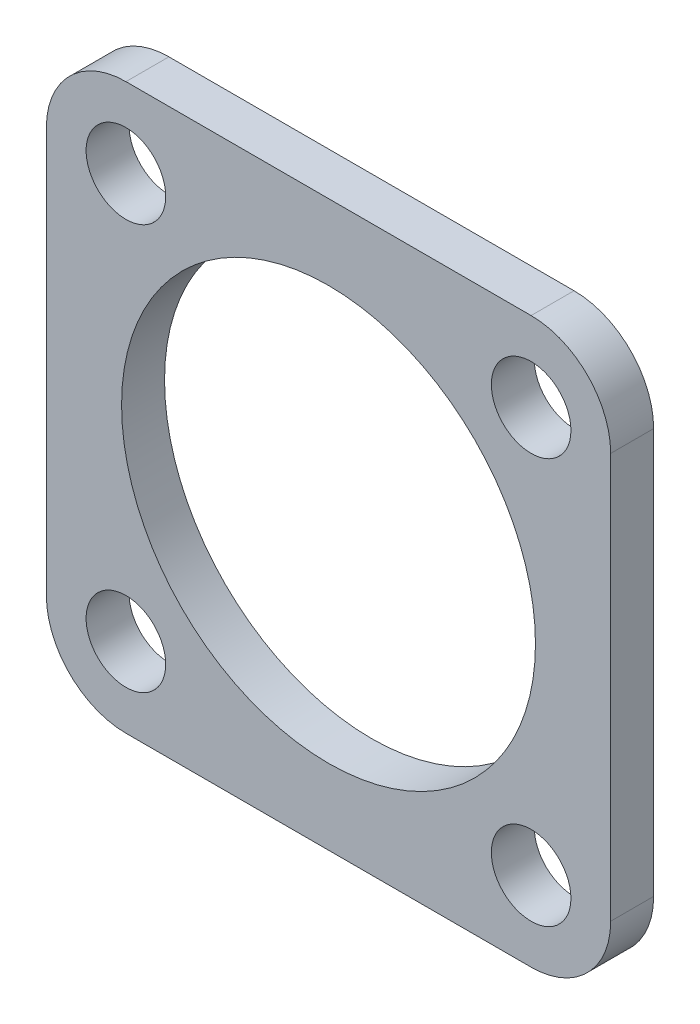
ISO-10303-21;
HEADER;
FILE_DESCRIPTION(('STEP AP214'),'2;1');
FILE_NAME('part.step','',(''),(''),'','','');
FILE_SCHEMA(('AUTOMOTIVE_DESIGN { 1 0 10303 214 1 1 1 1 }'));
ENDSEC;
DATA;
#1=APPLICATION_CONTEXT('core data for automotive mechanical design processes');
#2=APPLICATION_PROTOCOL_DEFINITION('international standard','automotive_design',2000,#1);
#3=PRODUCT_CONTEXT('',#1,'mechanical');
#4=PRODUCT('Part','Part','',(#3));
#5=PRODUCT_RELATED_PRODUCT_CATEGORY('part','',(#4));
#6=PRODUCT_DEFINITION_FORMATION('','',#4);
#7=PRODUCT_DEFINITION_CONTEXT('part definition',#1,'design');
#8=PRODUCT_DEFINITION('design','',#6,#7);
#9=PRODUCT_DEFINITION_SHAPE('','',#8);
#10=(LENGTH_UNIT() NAMED_UNIT(*) SI_UNIT(.MILLI.,.METRE.));
#11=(NAMED_UNIT(*) PLANE_ANGLE_UNIT() SI_UNIT($,.RADIAN.));
#12=(NAMED_UNIT(*) SI_UNIT($,.STERADIAN.) SOLID_ANGLE_UNIT());
#13=UNCERTAINTY_MEASURE_WITH_UNIT(LENGTH_MEASURE(1.E-05),#10,'distance_accuracy_value','');
#14=(GEOMETRIC_REPRESENTATION_CONTEXT(3) GLOBAL_UNCERTAINTY_ASSIGNED_CONTEXT((#13)) GLOBAL_UNIT_ASSIGNED_CONTEXT((#10,
#11,#12)) REPRESENTATION_CONTEXT('',''));
#15=CARTESIAN_POINT('',(0.,0.,0.));
#16=DIRECTION('',(0.,0.,1.));
#17=DIRECTION('',(1.,0.,0.));
#18=AXIS2_PLACEMENT_3D('',#15,#16,#17);
#19=CARTESIAN_POINT('',(0.,0.,-0.397201272555218));
#20=DIRECTION('',(-1.,0.,0.));
#21=DIRECTION('',(0.,0.,1.));
#22=AXIS2_PLACEMENT_3D('',#19,#20,#21);
#23=PLANE('',#22);
#24=DIRECTION('',(0.,-1.,0.));
#25=VECTOR('',#24,1.);
#26=CARTESIAN_POINT('',(0.,0.,-0.397201272555218));
#27=LINE('',#26,#25);
#28=CARTESIAN_POINT('',(0.,60.9,-0.397201272555218));
#29=VERTEX_POINT('',#28);
#30=CARTESIAN_POINT('',(0.,10.,-0.397201272555218));
#31=VERTEX_POINT('',#30);
#32=EDGE_CURVE('E182',#29,#31,#27,.T.);
#33=ORIENTED_EDGE('',*,*,#32,.T.);
#34=DIRECTION('',(0.,0.,1.));
#35=VECTOR('',#34,1.);
#36=CARTESIAN_POINT('',(0.,10.,-0.397201272555218));
#37=LINE('',#36,#35);
#38=CARTESIAN_POINT('',(0.,10.,5.));
#39=VERTEX_POINT('',#38);
#40=EDGE_CURVE('E176',#31,#39,#37,.T.);
#41=ORIENTED_EDGE('',*,*,#40,.T.);
#42=DIRECTION('',(0.,-1.,0.));
#43=VECTOR('',#42,1.);
#44=CARTESIAN_POINT('',(0.,0.,5.));
#45=LINE('',#44,#43);
#46=CARTESIAN_POINT('',(0.,60.9,5.));
#47=VERTEX_POINT('',#46);
#48=EDGE_CURVE('E116',#47,#39,#45,.T.);
#49=ORIENTED_EDGE('',*,*,#48,.F.);
#50=DIRECTION('',(0.,0.,1.));
#51=VECTOR('',#50,1.);
#52=CARTESIAN_POINT('',(0.,60.9,-0.397201272555218));
#53=LINE('',#52,#51);
#54=EDGE_CURVE('E173',#47,#29,#53,.F.);
#55=ORIENTED_EDGE('',*,*,#54,.T.);
#56=EDGE_LOOP('',(#33,#41,#49,#55));
#57=FACE_BOUND('',#56,.T.);
#58=ADVANCED_FACE('F43',(#57),#23,.T.);
#59=CARTESIAN_POINT('',(0.,70.9,-0.397201272555218));
#60=DIRECTION('',(0.,1.,0.));
#61=DIRECTION('',(0.,0.,1.));
#62=AXIS2_PLACEMENT_3D('',#59,#60,#61);
#63=PLANE('',#62);
#64=DIRECTION('',(-1.,0.,0.));
#65=VECTOR('',#64,1.);
#66=CARTESIAN_POINT('',(0.,70.9,-0.397201272555218));
#67=LINE('',#66,#65);
#68=CARTESIAN_POINT('',(60.9,70.9,-0.397201272555218));
#69=VERTEX_POINT('',#68);
#70=CARTESIAN_POINT('',(10.,70.9,-0.397201272555218));
#71=VERTEX_POINT('',#70);
#72=EDGE_CURVE('E140',#69,#71,#67,.T.);
#73=ORIENTED_EDGE('',*,*,#72,.T.);
#74=DIRECTION('',(0.,0.,1.));
#75=VECTOR('',#74,1.);
#76=CARTESIAN_POINT('',(10.,70.9,-0.397201272555218));
#77=LINE('',#76,#75);
#78=CARTESIAN_POINT('',(10.,70.9,5.));
#79=VERTEX_POINT('',#78);
#80=EDGE_CURVE('E11',#71,#79,#77,.T.);
#81=ORIENTED_EDGE('',*,*,#80,.T.);
#82=DIRECTION('',(-1.,0.,0.));
#83=VECTOR('',#82,1.);
#84=CARTESIAN_POINT('',(0.,70.9,5.));
#85=LINE('',#84,#83);
#86=CARTESIAN_POINT('',(60.9,70.9,5.));
#87=VERTEX_POINT('',#86);
#88=EDGE_CURVE('E207',#87,#79,#85,.T.);
#89=ORIENTED_EDGE('',*,*,#88,.F.);
#90=DIRECTION('',(0.,0.,1.));
#91=VECTOR('',#90,1.);
#92=CARTESIAN_POINT('',(60.9,70.9,-0.397201272555218));
#93=LINE('',#92,#91);
#94=EDGE_CURVE('E52',#87,#69,#93,.F.);
#95=ORIENTED_EDGE('',*,*,#94,.T.);
#96=EDGE_LOOP('',(#73,#81,#89,#95));
#97=FACE_BOUND('',#96,.T.);
#98=ADVANCED_FACE('F208',(#97),#63,.T.);
#99=CARTESIAN_POINT('',(70.9,0.,-0.397201272555218));
#100=DIRECTION('',(1.,0.,0.));
#101=DIRECTION('',(0.,0.,-1.));
#102=AXIS2_PLACEMENT_3D('',#99,#100,#101);
#103=PLANE('',#102);
#104=DIRECTION('',(0.,1.,0.));
#105=VECTOR('',#104,1.);
#106=CARTESIAN_POINT('',(70.9,0.,5.));
#107=LINE('',#106,#105);
#108=CARTESIAN_POINT('',(70.9,10.,5.));
#109=VERTEX_POINT('',#108);
#110=CARTESIAN_POINT('',(70.9,60.9,5.));
#111=VERTEX_POINT('',#110);
#112=EDGE_CURVE('E134',#109,#111,#107,.T.);
#113=ORIENTED_EDGE('',*,*,#112,.F.);
#114=DIRECTION('',(0.,0.,1.));
#115=VECTOR('',#114,1.);
#116=CARTESIAN_POINT('',(70.9,10.,-0.397201272555218));
#117=LINE('',#116,#115);
#118=CARTESIAN_POINT('',(70.9,10.,-0.397201272555218));
#119=VERTEX_POINT('',#118);
#120=EDGE_CURVE('E160',#109,#119,#117,.F.);
#121=ORIENTED_EDGE('',*,*,#120,.T.);
#122=DIRECTION('',(0.,1.,0.));
#123=VECTOR('',#122,1.);
#124=CARTESIAN_POINT('',(70.9,0.,-0.397201272555218));
#125=LINE('',#124,#123);
#126=CARTESIAN_POINT('',(70.9,60.9,-0.397201272555218));
#127=VERTEX_POINT('',#126);
#128=EDGE_CURVE('E146',#119,#127,#125,.T.);
#129=ORIENTED_EDGE('',*,*,#128,.T.);
#130=DIRECTION('',(0.,0.,1.));
#131=VECTOR('',#130,1.);
#132=CARTESIAN_POINT('',(70.9,60.9,-0.397201272555218));
#133=LINE('',#132,#131);
#134=EDGE_CURVE('E156',#127,#111,#133,.T.);
#135=ORIENTED_EDGE('',*,*,#134,.T.);
#136=EDGE_LOOP('',(#113,#121,#129,#135));
#137=FACE_BOUND('',#136,.T.);
#138=ADVANCED_FACE('F200',(#137),#103,.T.);
#139=CARTESIAN_POINT('',(0.,0.,-0.397201272555218));
#140=DIRECTION('',(0.,-1.,0.));
#141=DIRECTION('',(0.,0.,-1.));
#142=AXIS2_PLACEMENT_3D('',#139,#140,#141);
#143=PLANE('',#142);
#144=DIRECTION('',(1.,0.,0.));
#145=VECTOR('',#144,1.);
#146=CARTESIAN_POINT('',(0.,0.,-0.397201272555218));
#147=LINE('',#146,#145);
#148=CARTESIAN_POINT('',(10.,0.,-0.397201272555218));
#149=VERTEX_POINT('',#148);
#150=CARTESIAN_POINT('',(60.9,0.,-0.397201272555218));
#151=VERTEX_POINT('',#150);
#152=EDGE_CURVE('E184',#149,#151,#147,.T.);
#153=ORIENTED_EDGE('',*,*,#152,.T.);
#154=DIRECTION('',(0.,0.,1.));
#155=VECTOR('',#154,1.);
#156=CARTESIAN_POINT('',(60.9,0.,-0.397201272555218));
#157=LINE('',#156,#155);
#158=CARTESIAN_POINT('',(60.9,0.,5.));
#159=VERTEX_POINT('',#158);
#160=EDGE_CURVE('E132',#151,#159,#157,.T.);
#161=ORIENTED_EDGE('',*,*,#160,.T.);
#162=DIRECTION('',(1.,0.,0.));
#163=VECTOR('',#162,1.);
#164=CARTESIAN_POINT('',(0.,0.,5.));
#165=LINE('',#164,#163);
#166=CARTESIAN_POINT('',(10.,0.,5.));
#167=VERTEX_POINT('',#166);
#168=EDGE_CURVE('E114',#167,#159,#165,.T.);
#169=ORIENTED_EDGE('',*,*,#168,.F.);
#170=DIRECTION('',(0.,0.,1.));
#171=VECTOR('',#170,1.);
#172=CARTESIAN_POINT('',(10.,0.,-0.397201272555218));
#173=LINE('',#172,#171);
#174=EDGE_CURVE('E129',#167,#149,#173,.F.);
#175=ORIENTED_EDGE('',*,*,#174,.T.);
#176=EDGE_LOOP('',(#153,#161,#169,#175));
#177=FACE_BOUND('',#176,.T.);
#178=ADVANCED_FACE('F128',(#177),#143,.T.);
#179=CARTESIAN_POINT('',(0.,0.,-0.397201272555218));
#180=DIRECTION('',(0.,0.,-1.));
#181=DIRECTION('',(-1.,0.,0.));
#182=AXIS2_PLACEMENT_3D('',#179,#180,#181);
#183=PLANE('',#182);
#184=CARTESIAN_POINT('',(35.45,35.45,-0.397201272555218));
#185=DIRECTION('',(0.,0.,1.));
#186=DIRECTION('',(1.,0.,0.));
#187=AXIS2_PLACEMENT_3D('',#184,#185,#186);
#188=CIRCLE('',#187,26.);
#189=CARTESIAN_POINT('',(61.45,35.45,-0.397201272555218));
#190=VERTEX_POINT('',#189);
#191=EDGE_CURVE('E211',#190,#190,#188,.T.);
#192=ORIENTED_EDGE('',*,*,#191,.T.);
#193=EDGE_LOOP('',(#192));
#194=FACE_BOUND('',#193,.T.);
#195=CARTESIAN_POINT('',(9.995,9.995,-0.397201272555218));
#196=DIRECTION('',(0.,0.,1.));
#197=DIRECTION('',(-1.,0.,0.));
#198=AXIS2_PLACEMENT_3D('',#195,#196,#197);
#199=CIRCLE('',#198,5.);
#200=CARTESIAN_POINT('',(14.995,9.995,-0.397201272555218));
#201=VERTEX_POINT('',#200);
#202=EDGE_CURVE('E216',#201,#201,#199,.T.);
#203=ORIENTED_EDGE('',*,*,#202,.T.);
#204=EDGE_LOOP('',(#203));
#205=FACE_BOUND('',#204,.T.);
#206=CARTESIAN_POINT('',(60.905,9.995,-0.397201272555218));
#207=DIRECTION('',(0.,0.,1.));
#208=DIRECTION('',(1.,0.,0.));
#209=AXIS2_PLACEMENT_3D('',#206,#207,#208);
#210=CIRCLE('',#209,5.);
#211=CARTESIAN_POINT('',(65.905,9.995,-0.397201272555218));
#212=VERTEX_POINT('',#211);
#213=EDGE_CURVE('E223',#212,#212,#210,.T.);
#214=ORIENTED_EDGE('',*,*,#213,.T.);
#215=EDGE_LOOP('',(#214));
#216=FACE_BOUND('',#215,.T.);
#217=CARTESIAN_POINT('',(60.905,60.905,-0.397201272555218));
#218=DIRECTION('',(0.,0.,1.));
#219=DIRECTION('',(-1.,0.,0.));
#220=AXIS2_PLACEMENT_3D('',#217,#218,#219);
#221=CIRCLE('',#220,5.);
#222=CARTESIAN_POINT('',(65.905,60.905,-0.397201272555218));
#223=VERTEX_POINT('',#222);
#224=EDGE_CURVE('E191',#223,#223,#221,.T.);
#225=ORIENTED_EDGE('',*,*,#224,.T.);
#226=EDGE_LOOP('',(#225));
#227=FACE_BOUND('',#226,.T.);
#228=CARTESIAN_POINT('',(9.995,60.905,-0.397201272555218));
#229=DIRECTION('',(0.,0.,1.));
#230=DIRECTION('',(1.,0.,0.));
#231=AXIS2_PLACEMENT_3D('',#228,#229,#230);
#232=CIRCLE('',#231,5.);
#233=CARTESIAN_POINT('',(14.995,60.905,-0.397201272555218));
#234=VERTEX_POINT('',#233);
#235=EDGE_CURVE('E185',#234,#234,#232,.T.);
#236=ORIENTED_EDGE('',*,*,#235,.T.);
#237=EDGE_LOOP('',(#236));
#238=FACE_BOUND('',#237,.T.);
#239=ORIENTED_EDGE('',*,*,#128,.F.);
#240=CARTESIAN_POINT('',(60.9,10.,-0.397201272555218));
#241=DIRECTION('',(0.,0.,-1.));
#242=DIRECTION('',(-1.,0.,0.));
#243=AXIS2_PLACEMENT_3D('',#240,#241,#242);
#244=CIRCLE('',#243,10.);
#245=EDGE_CURVE('E170',#119,#151,#244,.T.);
#246=ORIENTED_EDGE('',*,*,#245,.T.);
#247=ORIENTED_EDGE('',*,*,#152,.F.);
#248=CARTESIAN_POINT('',(10.,10.,-0.397201272555218));
#249=DIRECTION('',(0.,0.,-1.));
#250=DIRECTION('',(-1.,0.,0.));
#251=AXIS2_PLACEMENT_3D('',#248,#249,#250);
#252=CIRCLE('',#251,10.);
#253=EDGE_CURVE('E138',#149,#31,#252,.T.);
#254=ORIENTED_EDGE('',*,*,#253,.T.);
#255=ORIENTED_EDGE('',*,*,#32,.F.);
#256=CARTESIAN_POINT('',(10.,60.9,-0.397201272555218));
#257=DIRECTION('',(0.,0.,-1.));
#258=DIRECTION('',(-1.,0.,0.));
#259=AXIS2_PLACEMENT_3D('',#256,#257,#258);
#260=CIRCLE('',#259,10.);
#261=EDGE_CURVE('E59',#29,#71,#260,.T.);
#262=ORIENTED_EDGE('',*,*,#261,.T.);
#263=ORIENTED_EDGE('',*,*,#72,.F.);
#264=CARTESIAN_POINT('',(60.9,60.9,-0.397201272555218));
#265=DIRECTION('',(0.,0.,-1.));
#266=DIRECTION('',(-1.,0.,0.));
#267=AXIS2_PLACEMENT_3D('',#264,#265,#266);
#268=CIRCLE('',#267,10.);
#269=EDGE_CURVE('E163',#69,#127,#268,.T.);
#270=ORIENTED_EDGE('',*,*,#269,.T.);
#271=EDGE_LOOP('',(#239,#246,#247,#254,#255,#262,#263,#270));
#272=FACE_BOUND('',#271,.T.);
#273=ADVANCED_FACE('F230',(#194,#205,#216,#227,#238,#272),#183,.T.);
#274=CARTESIAN_POINT('',(9.995,60.905,-0.397201272555218));
#275=DIRECTION('',(0.,0.,1.));
#276=DIRECTION('',(1.,0.,0.));
#277=AXIS2_PLACEMENT_3D('',#274,#275,#276);
#278=CYLINDRICAL_SURFACE('',#277,5.);
#279=CARTESIAN_POINT('',(9.995,60.905,5.));
#280=DIRECTION('',(0.,0.,1.));
#281=DIRECTION('',(1.,0.,0.));
#282=AXIS2_PLACEMENT_3D('',#279,#280,#281);
#283=CIRCLE('',#282,5.);
#284=CARTESIAN_POINT('',(14.995,60.905,5.));
#285=VERTEX_POINT('',#284);
#286=EDGE_CURVE('E244',#285,#285,#283,.T.);
#287=CARTESIAN_POINT('',(14.995,60.905,-0.397201272555218));
#288=CARTESIAN_POINT('',(14.995,60.905,-0.340980425966101));
#289=CARTESIAN_POINT('',(14.995,60.905,-0.284759579376984));
#290=CARTESIAN_POINT('',(14.995,60.905,-0.17231788619875));
#291=CARTESIAN_POINT('',(14.995,60.905,-0.116097039609634));
#292=CARTESIAN_POINT('',(14.995,60.905,-0.00365534643139982));
#293=CARTESIAN_POINT('',(14.995,60.905,0.052565500157717));
#294=CARTESIAN_POINT('',(14.995,60.905,0.165007193335951));
#295=CARTESIAN_POINT('',(14.995,60.905,0.221228039925068));
#296=CARTESIAN_POINT('',(14.995,60.905,0.333669733103301));
#297=CARTESIAN_POINT('',(14.995,60.905,0.389890579692418));
#298=CARTESIAN_POINT('',(14.995,60.905,0.502332272870652));
#299=CARTESIAN_POINT('',(14.995,60.905,0.558553119459769));
#300=CARTESIAN_POINT('',(14.995,60.905,0.670994812638002));
#301=CARTESIAN_POINT('',(14.995,60.905,0.727215659227119));
#302=CARTESIAN_POINT('',(14.995,60.905,0.839657352405353));
#303=CARTESIAN_POINT('',(14.995,60.905,0.89587819899447));
#304=CARTESIAN_POINT('',(14.995,60.905,1.0083198921727));
#305=CARTESIAN_POINT('',(14.995,60.905,1.06454073876182));
#306=CARTESIAN_POINT('',(14.995,60.905,1.17698243194005));
#307=CARTESIAN_POINT('',(14.995,60.905,1.23320327852917));
#308=CARTESIAN_POINT('',(14.995,60.905,1.3456449717074));
#309=CARTESIAN_POINT('',(14.995,60.905,1.40186581829652));
#310=CARTESIAN_POINT('',(14.995,60.905,1.51430751147476));
#311=CARTESIAN_POINT('',(14.995,60.905,1.57052835806387));
#312=CARTESIAN_POINT('',(14.995,60.905,1.68297005124211));
#313=CARTESIAN_POINT('',(14.995,60.905,1.73919089783122));
#314=CARTESIAN_POINT('',(14.995,60.905,1.85163259100946));
#315=CARTESIAN_POINT('',(14.995,60.905,1.90785343759857));
#316=CARTESIAN_POINT('',(14.995,60.905,2.02029513077681));
#317=CARTESIAN_POINT('',(14.995,60.905,2.07651597736592));
#318=CARTESIAN_POINT('',(14.995,60.905,2.18895767054416));
#319=CARTESIAN_POINT('',(14.995,60.905,2.24517851713327));
#320=CARTESIAN_POINT('',(14.995,60.905,2.35762021031151));
#321=CARTESIAN_POINT('',(14.995,60.905,2.41384105690062));
#322=CARTESIAN_POINT('',(14.995,60.905,2.52628275007886));
#323=CARTESIAN_POINT('',(14.995,60.905,2.58250359666798));
#324=CARTESIAN_POINT('',(14.995,60.905,2.69494528984621));
#325=CARTESIAN_POINT('',(14.995,60.905,2.75116613643533));
#326=CARTESIAN_POINT('',(14.995,60.905,2.86360782961356));
#327=CARTESIAN_POINT('',(14.995,60.905,2.91982867620268));
#328=CARTESIAN_POINT('',(14.995,60.905,3.03227036938091));
#329=CARTESIAN_POINT('',(14.995,60.905,3.08849121597003));
#330=CARTESIAN_POINT('',(14.995,60.905,3.20093290914826));
#331=CARTESIAN_POINT('',(14.995,60.905,3.25715375573738));
#332=CARTESIAN_POINT('',(14.995,60.905,3.36959544891561));
#333=CARTESIAN_POINT('',(14.995,60.905,3.42581629550473));
#334=CARTESIAN_POINT('',(14.995,60.905,3.53825798868296));
#335=CARTESIAN_POINT('',(14.995,60.905,3.59447883527208));
#336=CARTESIAN_POINT('',(14.995,60.905,3.70692052845031));
#337=CARTESIAN_POINT('',(14.995,60.905,3.76314137503943));
#338=CARTESIAN_POINT('',(14.995,60.905,3.87558306821766));
#339=CARTESIAN_POINT('',(14.995,60.905,3.93180391480678));
#340=CARTESIAN_POINT('',(14.995,60.905,4.04424560798501));
#341=CARTESIAN_POINT('',(14.995,60.905,4.10046645457413));
#342=CARTESIAN_POINT('',(14.995,60.905,4.21290814775236));
#343=CARTESIAN_POINT('',(14.995,60.905,4.26912899434148));
#344=CARTESIAN_POINT('',(14.995,60.905,4.38157068751971));
#345=CARTESIAN_POINT('',(14.995,60.905,4.43779153410883));
#346=CARTESIAN_POINT('',(14.995,60.905,4.55023322728707));
#347=CARTESIAN_POINT('',(14.995,60.905,4.60645407387618));
#348=CARTESIAN_POINT('',(14.995,60.905,4.71889576705442));
#349=CARTESIAN_POINT('',(14.995,60.905,4.77511661364353));
#350=CARTESIAN_POINT('',(14.995,60.905,4.88755830682177));
#351=CARTESIAN_POINT('',(14.995,60.905,4.94377915341088));
#352=CARTESIAN_POINT('',(14.995,60.905,5.));
#353=B_SPLINE_CURVE_WITH_KNOTS('',3,(#287,#288,#289,#290,#291,#292,#293,#294,#295,#296,#297,
#298,#299,#300,#301,#302,#303,#304,#305,#306,#307,#308,#309,#310,#311,#312,#313,#314,#315,#316,
#317,#318,#319,#320,#321,#322,#323,#324,#325,#326,#327,#328,#329,#330,#331,#332,#333,#334,#335,
#336,#337,#338,#339,#340,#341,#342,#343,#344,#345,#346,#347,#348,#349,#350,#351,#352),
.UNSPECIFIED.,.F.,.F.,(4,2,2,2,2,2,2,2,2,2,2,2,2,2,2,2,2,2,2,2,2,2,2,2,2,2,2,2,2,2,2,2,4),(0.,
0.168662539767351,0.337325079534701,0.505987619302052,0.674650159069402,0.843312698836753,
1.0119752386041,1.18063777837145,1.3493003181388,1.51796285790616,1.68662539767351,
1.85528793744086,2.02395047720821,2.19261301697556,2.36127555674291,2.52993809651026,
2.69860063627761,2.86726317604496,3.03592571581231,3.20458825557966,3.37325079534701,
3.54191333511436,3.71057587488171,3.87923841464906,4.04790095441641,4.21656349418376,
4.38522603395111,4.55388857371847,4.72255111348582,4.89121365325317,5.05987619302052,
5.22853873278787,5.39720127255522),.UNSPECIFIED.);
#354=EDGE_CURVE('BSEAM237',#234,#285,#353,.T.);
#355=ORIENTED_EDGE('',*,*,#235,.F.);
#356=ORIENTED_EDGE('',*,*,#286,.T.);
#357=ORIENTED_EDGE('',*,*,#354,.T.);
#358=ORIENTED_EDGE('',*,*,#354,.F.);
#359=EDGE_LOOP('',(#355,#357,#356,#358));
#360=FACE_BOUND('',#359,.T.);
#361=ADVANCED_FACE('F237',(#360),#278,.F.);
#362=CARTESIAN_POINT('',(60.905,60.905,-0.397201272555218));
#363=DIRECTION('',(0.,0.,1.));
#364=DIRECTION('',(1.,0.,0.));
#365=AXIS2_PLACEMENT_3D('',#362,#363,#364);
#366=CYLINDRICAL_SURFACE('',#365,5.);
#367=CARTESIAN_POINT('',(60.905,60.905,5.));
#368=DIRECTION('',(0.,0.,1.));
#369=DIRECTION('',(-1.,0.,0.));
#370=AXIS2_PLACEMENT_3D('',#367,#368,#369);
#371=CIRCLE('',#370,5.);
#372=CARTESIAN_POINT('',(65.905,60.905,5.));
#373=VERTEX_POINT('',#372);
#374=EDGE_CURVE('E241',#373,#373,#371,.T.);
#375=CARTESIAN_POINT('',(65.905,60.905,-0.397201272555218));
#376=CARTESIAN_POINT('',(65.905,60.905,-0.340980425966101));
#377=CARTESIAN_POINT('',(65.905,60.905,-0.284759579376984));
#378=CARTESIAN_POINT('',(65.905,60.905,-0.17231788619875));
#379=CARTESIAN_POINT('',(65.905,60.905,-0.116097039609634));
#380=CARTESIAN_POINT('',(65.905,60.905,-0.00365534643139982));
#381=CARTESIAN_POINT('',(65.905,60.905,0.052565500157717));
#382=CARTESIAN_POINT('',(65.905,60.905,0.165007193335951));
#383=CARTESIAN_POINT('',(65.905,60.905,0.221228039925068));
#384=CARTESIAN_POINT('',(65.905,60.905,0.333669733103301));
#385=CARTESIAN_POINT('',(65.905,60.905,0.389890579692418));
#386=CARTESIAN_POINT('',(65.905,60.905,0.502332272870652));
#387=CARTESIAN_POINT('',(65.905,60.905,0.558553119459769));
#388=CARTESIAN_POINT('',(65.905,60.905,0.670994812638002));
#389=CARTESIAN_POINT('',(65.905,60.905,0.727215659227119));
#390=CARTESIAN_POINT('',(65.905,60.905,0.839657352405353));
#391=CARTESIAN_POINT('',(65.905,60.905,0.89587819899447));
#392=CARTESIAN_POINT('',(65.905,60.905,1.0083198921727));
#393=CARTESIAN_POINT('',(65.905,60.905,1.06454073876182));
#394=CARTESIAN_POINT('',(65.905,60.905,1.17698243194005));
#395=CARTESIAN_POINT('',(65.905,60.905,1.23320327852917));
#396=CARTESIAN_POINT('',(65.905,60.905,1.3456449717074));
#397=CARTESIAN_POINT('',(65.905,60.905,1.40186581829652));
#398=CARTESIAN_POINT('',(65.905,60.905,1.51430751147476));
#399=CARTESIAN_POINT('',(65.905,60.905,1.57052835806387));
#400=CARTESIAN_POINT('',(65.905,60.905,1.68297005124211));
#401=CARTESIAN_POINT('',(65.905,60.905,1.73919089783122));
#402=CARTESIAN_POINT('',(65.905,60.905,1.85163259100946));
#403=CARTESIAN_POINT('',(65.905,60.905,1.90785343759857));
#404=CARTESIAN_POINT('',(65.905,60.905,2.02029513077681));
#405=CARTESIAN_POINT('',(65.905,60.905,2.07651597736592));
#406=CARTESIAN_POINT('',(65.905,60.905,2.18895767054416));
#407=CARTESIAN_POINT('',(65.905,60.905,2.24517851713327));
#408=CARTESIAN_POINT('',(65.905,60.905,2.35762021031151));
#409=CARTESIAN_POINT('',(65.905,60.905,2.41384105690062));
#410=CARTESIAN_POINT('',(65.905,60.905,2.52628275007886));
#411=CARTESIAN_POINT('',(65.905,60.905,2.58250359666798));
#412=CARTESIAN_POINT('',(65.905,60.905,2.69494528984621));
#413=CARTESIAN_POINT('',(65.905,60.905,2.75116613643533));
#414=CARTESIAN_POINT('',(65.905,60.905,2.86360782961356));
#415=CARTESIAN_POINT('',(65.905,60.905,2.91982867620268));
#416=CARTESIAN_POINT('',(65.905,60.905,3.03227036938091));
#417=CARTESIAN_POINT('',(65.905,60.905,3.08849121597003));
#418=CARTESIAN_POINT('',(65.905,60.905,3.20093290914826));
#419=CARTESIAN_POINT('',(65.905,60.905,3.25715375573738));
#420=CARTESIAN_POINT('',(65.905,60.905,3.36959544891561));
#421=CARTESIAN_POINT('',(65.905,60.905,3.42581629550473));
#422=CARTESIAN_POINT('',(65.905,60.905,3.53825798868296));
#423=CARTESIAN_POINT('',(65.905,60.905,3.59447883527208));
#424=CARTESIAN_POINT('',(65.905,60.905,3.70692052845031));
#425=CARTESIAN_POINT('',(65.905,60.905,3.76314137503943));
#426=CARTESIAN_POINT('',(65.905,60.905,3.87558306821766));
#427=CARTESIAN_POINT('',(65.905,60.905,3.93180391480678));
#428=CARTESIAN_POINT('',(65.905,60.905,4.04424560798501));
#429=CARTESIAN_POINT('',(65.905,60.905,4.10046645457413));
#430=CARTESIAN_POINT('',(65.905,60.905,4.21290814775236));
#431=CARTESIAN_POINT('',(65.905,60.905,4.26912899434148));
#432=CARTESIAN_POINT('',(65.905,60.905,4.38157068751971));
#433=CARTESIAN_POINT('',(65.905,60.905,4.43779153410883));
#434=CARTESIAN_POINT('',(65.905,60.905,4.55023322728707));
#435=CARTESIAN_POINT('',(65.905,60.905,4.60645407387618));
#436=CARTESIAN_POINT('',(65.905,60.905,4.71889576705442));
#437=CARTESIAN_POINT('',(65.905,60.905,4.77511661364353));
#438=CARTESIAN_POINT('',(65.905,60.905,4.88755830682177));
#439=CARTESIAN_POINT('',(65.905,60.905,4.94377915341088));
#440=CARTESIAN_POINT('',(65.905,60.905,5.));
#441=B_SPLINE_CURVE_WITH_KNOTS('',3,(#375,#376,#377,#378,#379,#380,#381,#382,#383,#384,#385,
#386,#387,#388,#389,#390,#391,#392,#393,#394,#395,#396,#397,#398,#399,#400,#401,#402,#403,#404,
#405,#406,#407,#408,#409,#410,#411,#412,#413,#414,#415,#416,#417,#418,#419,#420,#421,#422,#423,
#424,#425,#426,#427,#428,#429,#430,#431,#432,#433,#434,#435,#436,#437,#438,#439,#440),
.UNSPECIFIED.,.F.,.F.,(4,2,2,2,2,2,2,2,2,2,2,2,2,2,2,2,2,2,2,2,2,2,2,2,2,2,2,2,2,2,2,2,4),(0.,
0.168662539767351,0.337325079534701,0.505987619302052,0.674650159069402,0.843312698836753,
1.0119752386041,1.18063777837145,1.3493003181388,1.51796285790616,1.68662539767351,
1.85528793744086,2.02395047720821,2.19261301697556,2.36127555674291,2.52993809651026,
2.69860063627761,2.86726317604496,3.03592571581231,3.20458825557966,3.37325079534701,
3.54191333511436,3.71057587488171,3.87923841464906,4.04790095441641,4.21656349418376,
4.38522603395111,4.55388857371847,4.72255111348582,4.89121365325317,5.05987619302052,
5.22853873278787,5.39720127255522),.UNSPECIFIED.);
#442=EDGE_CURVE('BSEAM233',#223,#373,#441,.T.);
#443=ORIENTED_EDGE('',*,*,#224,.F.);
#444=ORIENTED_EDGE('',*,*,#374,.T.);
#445=ORIENTED_EDGE('',*,*,#442,.T.);
#446=ORIENTED_EDGE('',*,*,#442,.F.);
#447=EDGE_LOOP('',(#443,#445,#444,#446));
#448=FACE_BOUND('',#447,.T.);
#449=ADVANCED_FACE('F233',(#448),#366,.F.);
#450=CARTESIAN_POINT('',(60.905,9.995,-0.397201272555218));
#451=DIRECTION('',(0.,0.,1.));
#452=DIRECTION('',(1.,0.,0.));
#453=AXIS2_PLACEMENT_3D('',#450,#451,#452);
#454=CYLINDRICAL_SURFACE('',#453,5.);
#455=CARTESIAN_POINT('',(60.905,9.995,5.));
#456=DIRECTION('',(0.,0.,1.));
#457=DIRECTION('',(1.,0.,0.));
#458=AXIS2_PLACEMENT_3D('',#455,#456,#457);
#459=CIRCLE('',#458,5.);
#460=CARTESIAN_POINT('',(65.905,9.995,5.));
#461=VERTEX_POINT('',#460);
#462=EDGE_CURVE('E245',#461,#461,#459,.T.);
#463=CARTESIAN_POINT('',(65.905,9.995,-0.397201272555218));
#464=CARTESIAN_POINT('',(65.905,9.995,-0.340980425966101));
#465=CARTESIAN_POINT('',(65.905,9.995,-0.284759579376984));
#466=CARTESIAN_POINT('',(65.905,9.995,-0.17231788619875));
#467=CARTESIAN_POINT('',(65.905,9.995,-0.116097039609634));
#468=CARTESIAN_POINT('',(65.905,9.995,-0.00365534643139982));
#469=CARTESIAN_POINT('',(65.905,9.995,0.052565500157717));
#470=CARTESIAN_POINT('',(65.905,9.995,0.165007193335951));
#471=CARTESIAN_POINT('',(65.905,9.995,0.221228039925068));
#472=CARTESIAN_POINT('',(65.905,9.995,0.333669733103301));
#473=CARTESIAN_POINT('',(65.905,9.995,0.389890579692418));
#474=CARTESIAN_POINT('',(65.905,9.995,0.502332272870652));
#475=CARTESIAN_POINT('',(65.905,9.995,0.558553119459769));
#476=CARTESIAN_POINT('',(65.905,9.995,0.670994812638002));
#477=CARTESIAN_POINT('',(65.905,9.995,0.727215659227119));
#478=CARTESIAN_POINT('',(65.905,9.995,0.839657352405353));
#479=CARTESIAN_POINT('',(65.905,9.995,0.89587819899447));
#480=CARTESIAN_POINT('',(65.905,9.995,1.0083198921727));
#481=CARTESIAN_POINT('',(65.905,9.995,1.06454073876182));
#482=CARTESIAN_POINT('',(65.905,9.995,1.17698243194005));
#483=CARTESIAN_POINT('',(65.905,9.995,1.23320327852917));
#484=CARTESIAN_POINT('',(65.905,9.995,1.3456449717074));
#485=CARTESIAN_POINT('',(65.905,9.995,1.40186581829652));
#486=CARTESIAN_POINT('',(65.905,9.995,1.51430751147476));
#487=CARTESIAN_POINT('',(65.905,9.995,1.57052835806387));
#488=CARTESIAN_POINT('',(65.905,9.995,1.68297005124211));
#489=CARTESIAN_POINT('',(65.905,9.995,1.73919089783122));
#490=CARTESIAN_POINT('',(65.905,9.995,1.85163259100946));
#491=CARTESIAN_POINT('',(65.905,9.995,1.90785343759857));
#492=CARTESIAN_POINT('',(65.905,9.995,2.02029513077681));
#493=CARTESIAN_POINT('',(65.905,9.995,2.07651597736592));
#494=CARTESIAN_POINT('',(65.905,9.995,2.18895767054416));
#495=CARTESIAN_POINT('',(65.905,9.995,2.24517851713327));
#496=CARTESIAN_POINT('',(65.905,9.995,2.35762021031151));
#497=CARTESIAN_POINT('',(65.905,9.995,2.41384105690062));
#498=CARTESIAN_POINT('',(65.905,9.995,2.52628275007886));
#499=CARTESIAN_POINT('',(65.905,9.995,2.58250359666798));
#500=CARTESIAN_POINT('',(65.905,9.995,2.69494528984621));
#501=CARTESIAN_POINT('',(65.905,9.995,2.75116613643533));
#502=CARTESIAN_POINT('',(65.905,9.995,2.86360782961356));
#503=CARTESIAN_POINT('',(65.905,9.995,2.91982867620268));
#504=CARTESIAN_POINT('',(65.905,9.995,3.03227036938091));
#505=CARTESIAN_POINT('',(65.905,9.995,3.08849121597003));
#506=CARTESIAN_POINT('',(65.905,9.995,3.20093290914826));
#507=CARTESIAN_POINT('',(65.905,9.995,3.25715375573738));
#508=CARTESIAN_POINT('',(65.905,9.995,3.36959544891561));
#509=CARTESIAN_POINT('',(65.905,9.995,3.42581629550473));
#510=CARTESIAN_POINT('',(65.905,9.995,3.53825798868296));
#511=CARTESIAN_POINT('',(65.905,9.995,3.59447883527208));
#512=CARTESIAN_POINT('',(65.905,9.995,3.70692052845031));
#513=CARTESIAN_POINT('',(65.905,9.995,3.76314137503943));
#514=CARTESIAN_POINT('',(65.905,9.995,3.87558306821766));
#515=CARTESIAN_POINT('',(65.905,9.995,3.93180391480678));
#516=CARTESIAN_POINT('',(65.905,9.995,4.04424560798501));
#517=CARTESIAN_POINT('',(65.905,9.995,4.10046645457413));
#518=CARTESIAN_POINT('',(65.905,9.995,4.21290814775236));
#519=CARTESIAN_POINT('',(65.905,9.995,4.26912899434148));
#520=CARTESIAN_POINT('',(65.905,9.995,4.38157068751971));
#521=CARTESIAN_POINT('',(65.905,9.995,4.43779153410883));
#522=CARTESIAN_POINT('',(65.905,9.995,4.55023322728707));
#523=CARTESIAN_POINT('',(65.905,9.995,4.60645407387618));
#524=CARTESIAN_POINT('',(65.905,9.995,4.71889576705442));
#525=CARTESIAN_POINT('',(65.905,9.995,4.77511661364353));
#526=CARTESIAN_POINT('',(65.905,9.995,4.88755830682177));
#527=CARTESIAN_POINT('',(65.905,9.995,4.94377915341088));
#528=CARTESIAN_POINT('',(65.905,9.995,5.));
#529=B_SPLINE_CURVE_WITH_KNOTS('',3,(#463,#464,#465,#466,#467,#468,#469,#470,#471,#472,#473,
#474,#475,#476,#477,#478,#479,#480,#481,#482,#483,#484,#485,#486,#487,#488,#489,#490,#491,#492,
#493,#494,#495,#496,#497,#498,#499,#500,#501,#502,#503,#504,#505,#506,#507,#508,#509,#510,#511,
#512,#513,#514,#515,#516,#517,#518,#519,#520,#521,#522,#523,#524,#525,#526,#527,#528),
.UNSPECIFIED.,.F.,.F.,(4,2,2,2,2,2,2,2,2,2,2,2,2,2,2,2,2,2,2,2,2,2,2,2,2,2,2,2,2,2,2,2,4),(0.,
0.168662539767351,0.337325079534701,0.505987619302052,0.674650159069402,0.843312698836753,
1.0119752386041,1.18063777837145,1.3493003181388,1.51796285790616,1.68662539767351,
1.85528793744086,2.02395047720821,2.19261301697556,2.36127555674291,2.52993809651026,
2.69860063627761,2.86726317604496,3.03592571581231,3.20458825557966,3.37325079534701,
3.54191333511436,3.71057587488171,3.87923841464906,4.04790095441641,4.21656349418376,
4.38522603395111,4.55388857371847,4.72255111348582,4.89121365325317,5.05987619302052,
5.22853873278787,5.39720127255522),.UNSPECIFIED.);
#530=EDGE_CURVE('BSEAM236',#212,#461,#529,.T.);
#531=ORIENTED_EDGE('',*,*,#213,.F.);
#532=ORIENTED_EDGE('',*,*,#462,.T.);
#533=ORIENTED_EDGE('',*,*,#530,.T.);
#534=ORIENTED_EDGE('',*,*,#530,.F.);
#535=EDGE_LOOP('',(#531,#533,#532,#534));
#536=FACE_BOUND('',#535,.T.);
#537=ADVANCED_FACE('F236',(#536),#454,.F.);
#538=CARTESIAN_POINT('',(9.995,9.995,-0.397201272555218));
#539=DIRECTION('',(0.,0.,1.));
#540=DIRECTION('',(1.,0.,0.));
#541=AXIS2_PLACEMENT_3D('',#538,#539,#540);
#542=CYLINDRICAL_SURFACE('',#541,5.);
#543=CARTESIAN_POINT('',(9.995,9.995,5.));
#544=DIRECTION('',(0.,0.,1.));
#545=DIRECTION('',(-1.,0.,0.));
#546=AXIS2_PLACEMENT_3D('',#543,#544,#545);
#547=CIRCLE('',#546,5.);
#548=CARTESIAN_POINT('',(14.995,9.995,5.));
#549=VERTEX_POINT('',#548);
#550=EDGE_CURVE('E252',#549,#549,#547,.T.);
#551=CARTESIAN_POINT('',(14.995,9.995,-0.397201272555218));
#552=CARTESIAN_POINT('',(14.995,9.995,-0.340980425966101));
#553=CARTESIAN_POINT('',(14.995,9.995,-0.284759579376984));
#554=CARTESIAN_POINT('',(14.995,9.995,-0.17231788619875));
#555=CARTESIAN_POINT('',(14.995,9.995,-0.116097039609634));
#556=CARTESIAN_POINT('',(14.995,9.995,-0.00365534643139982));
#557=CARTESIAN_POINT('',(14.995,9.995,0.052565500157717));
#558=CARTESIAN_POINT('',(14.995,9.995,0.165007193335951));
#559=CARTESIAN_POINT('',(14.995,9.995,0.221228039925068));
#560=CARTESIAN_POINT('',(14.995,9.995,0.333669733103301));
#561=CARTESIAN_POINT('',(14.995,9.995,0.389890579692418));
#562=CARTESIAN_POINT('',(14.995,9.995,0.502332272870652));
#563=CARTESIAN_POINT('',(14.995,9.995,0.558553119459769));
#564=CARTESIAN_POINT('',(14.995,9.995,0.670994812638002));
#565=CARTESIAN_POINT('',(14.995,9.995,0.727215659227119));
#566=CARTESIAN_POINT('',(14.995,9.995,0.839657352405353));
#567=CARTESIAN_POINT('',(14.995,9.995,0.89587819899447));
#568=CARTESIAN_POINT('',(14.995,9.995,1.0083198921727));
#569=CARTESIAN_POINT('',(14.995,9.995,1.06454073876182));
#570=CARTESIAN_POINT('',(14.995,9.995,1.17698243194005));
#571=CARTESIAN_POINT('',(14.995,9.995,1.23320327852917));
#572=CARTESIAN_POINT('',(14.995,9.995,1.3456449717074));
#573=CARTESIAN_POINT('',(14.995,9.995,1.40186581829652));
#574=CARTESIAN_POINT('',(14.995,9.995,1.51430751147476));
#575=CARTESIAN_POINT('',(14.995,9.995,1.57052835806387));
#576=CARTESIAN_POINT('',(14.995,9.995,1.68297005124211));
#577=CARTESIAN_POINT('',(14.995,9.995,1.73919089783122));
#578=CARTESIAN_POINT('',(14.995,9.995,1.85163259100946));
#579=CARTESIAN_POINT('',(14.995,9.995,1.90785343759857));
#580=CARTESIAN_POINT('',(14.995,9.995,2.02029513077681));
#581=CARTESIAN_POINT('',(14.995,9.995,2.07651597736592));
#582=CARTESIAN_POINT('',(14.995,9.995,2.18895767054416));
#583=CARTESIAN_POINT('',(14.995,9.995,2.24517851713327));
#584=CARTESIAN_POINT('',(14.995,9.995,2.35762021031151));
#585=CARTESIAN_POINT('',(14.995,9.995,2.41384105690062));
#586=CARTESIAN_POINT('',(14.995,9.995,2.52628275007886));
#587=CARTESIAN_POINT('',(14.995,9.995,2.58250359666798));
#588=CARTESIAN_POINT('',(14.995,9.995,2.69494528984621));
#589=CARTESIAN_POINT('',(14.995,9.995,2.75116613643533));
#590=CARTESIAN_POINT('',(14.995,9.995,2.86360782961356));
#591=CARTESIAN_POINT('',(14.995,9.995,2.91982867620268));
#592=CARTESIAN_POINT('',(14.995,9.995,3.03227036938091));
#593=CARTESIAN_POINT('',(14.995,9.995,3.08849121597003));
#594=CARTESIAN_POINT('',(14.995,9.995,3.20093290914826));
#595=CARTESIAN_POINT('',(14.995,9.995,3.25715375573738));
#596=CARTESIAN_POINT('',(14.995,9.995,3.36959544891561));
#597=CARTESIAN_POINT('',(14.995,9.995,3.42581629550473));
#598=CARTESIAN_POINT('',(14.995,9.995,3.53825798868296));
#599=CARTESIAN_POINT('',(14.995,9.995,3.59447883527208));
#600=CARTESIAN_POINT('',(14.995,9.995,3.70692052845031));
#601=CARTESIAN_POINT('',(14.995,9.995,3.76314137503943));
#602=CARTESIAN_POINT('',(14.995,9.995,3.87558306821766));
#603=CARTESIAN_POINT('',(14.995,9.995,3.93180391480678));
#604=CARTESIAN_POINT('',(14.995,9.995,4.04424560798501));
#605=CARTESIAN_POINT('',(14.995,9.995,4.10046645457413));
#606=CARTESIAN_POINT('',(14.995,9.995,4.21290814775236));
#607=CARTESIAN_POINT('',(14.995,9.995,4.26912899434148));
#608=CARTESIAN_POINT('',(14.995,9.995,4.38157068751971));
#609=CARTESIAN_POINT('',(14.995,9.995,4.43779153410883));
#610=CARTESIAN_POINT('',(14.995,9.995,4.55023322728707));
#611=CARTESIAN_POINT('',(14.995,9.995,4.60645407387618));
#612=CARTESIAN_POINT('',(14.995,9.995,4.71889576705442));
#613=CARTESIAN_POINT('',(14.995,9.995,4.77511661364353));
#614=CARTESIAN_POINT('',(14.995,9.995,4.88755830682177));
#615=CARTESIAN_POINT('',(14.995,9.995,4.94377915341088));
#616=CARTESIAN_POINT('',(14.995,9.995,5.));
#617=B_SPLINE_CURVE_WITH_KNOTS('',3,(#551,#552,#553,#554,#555,#556,#557,#558,#559,#560,#561,
#562,#563,#564,#565,#566,#567,#568,#569,#570,#571,#572,#573,#574,#575,#576,#577,#578,#579,#580,
#581,#582,#583,#584,#585,#586,#587,#588,#589,#590,#591,#592,#593,#594,#595,#596,#597,#598,#599,
#600,#601,#602,#603,#604,#605,#606,#607,#608,#609,#610,#611,#612,#613,#614,#615,#616),
.UNSPECIFIED.,.F.,.F.,(4,2,2,2,2,2,2,2,2,2,2,2,2,2,2,2,2,2,2,2,2,2,2,2,2,2,2,2,2,2,2,2,4),(0.,
0.168662539767351,0.337325079534701,0.505987619302052,0.674650159069402,0.843312698836753,
1.0119752386041,1.18063777837145,1.3493003181388,1.51796285790616,1.68662539767351,
1.85528793744086,2.02395047720821,2.19261301697556,2.36127555674291,2.52993809651026,
2.69860063627761,2.86726317604496,3.03592571581231,3.20458825557966,3.37325079534701,
3.54191333511436,3.71057587488171,3.87923841464906,4.04790095441641,4.21656349418376,
4.38522603395111,4.55388857371847,4.72255111348582,4.89121365325317,5.05987619302052,
5.22853873278787,5.39720127255522),.UNSPECIFIED.);
#618=EDGE_CURVE('BSEAM277',#201,#549,#617,.T.);
#619=ORIENTED_EDGE('',*,*,#202,.F.);
#620=ORIENTED_EDGE('',*,*,#550,.T.);
#621=ORIENTED_EDGE('',*,*,#618,.T.);
#622=ORIENTED_EDGE('',*,*,#618,.F.);
#623=EDGE_LOOP('',(#619,#621,#620,#622));
#624=FACE_BOUND('',#623,.T.);
#625=ADVANCED_FACE('F277',(#624),#542,.F.);
#626=CARTESIAN_POINT('',(35.45,35.45,-0.397201272555218));
#627=DIRECTION('',(0.,0.,1.));
#628=DIRECTION('',(1.,0.,0.));
#629=AXIS2_PLACEMENT_3D('',#626,#627,#628);
#630=CYLINDRICAL_SURFACE('',#629,26.);
#631=CARTESIAN_POINT('',(35.45,35.45,5.));
#632=DIRECTION('',(0.,0.,1.));
#633=DIRECTION('',(1.,0.,0.));
#634=AXIS2_PLACEMENT_3D('',#631,#632,#633);
#635=CIRCLE('',#634,26.);
#636=CARTESIAN_POINT('',(61.45,35.45,5.));
#637=VERTEX_POINT('',#636);
#638=EDGE_CURVE('E260',#637,#637,#635,.T.);
#639=CARTESIAN_POINT('',(61.45,35.45,-0.397201272555218));
#640=CARTESIAN_POINT('',(61.45,35.45,-0.340980425966101));
#641=CARTESIAN_POINT('',(61.45,35.45,-0.284759579376984));
#642=CARTESIAN_POINT('',(61.45,35.45,-0.17231788619875));
#643=CARTESIAN_POINT('',(61.45,35.45,-0.116097039609634));
#644=CARTESIAN_POINT('',(61.45,35.45,-0.00365534643139982));
#645=CARTESIAN_POINT('',(61.45,35.45,0.052565500157717));
#646=CARTESIAN_POINT('',(61.45,35.45,0.165007193335951));
#647=CARTESIAN_POINT('',(61.45,35.45,0.221228039925068));
#648=CARTESIAN_POINT('',(61.45,35.45,0.333669733103301));
#649=CARTESIAN_POINT('',(61.45,35.45,0.389890579692418));
#650=CARTESIAN_POINT('',(61.45,35.45,0.502332272870652));
#651=CARTESIAN_POINT('',(61.45,35.45,0.558553119459769));
#652=CARTESIAN_POINT('',(61.45,35.45,0.670994812638002));
#653=CARTESIAN_POINT('',(61.45,35.45,0.727215659227119));
#654=CARTESIAN_POINT('',(61.45,35.45,0.839657352405353));
#655=CARTESIAN_POINT('',(61.45,35.45,0.89587819899447));
#656=CARTESIAN_POINT('',(61.45,35.45,1.0083198921727));
#657=CARTESIAN_POINT('',(61.45,35.45,1.06454073876182));
#658=CARTESIAN_POINT('',(61.45,35.45,1.17698243194005));
#659=CARTESIAN_POINT('',(61.45,35.45,1.23320327852917));
#660=CARTESIAN_POINT('',(61.45,35.45,1.3456449717074));
#661=CARTESIAN_POINT('',(61.45,35.45,1.40186581829652));
#662=CARTESIAN_POINT('',(61.45,35.45,1.51430751147476));
#663=CARTESIAN_POINT('',(61.45,35.45,1.57052835806387));
#664=CARTESIAN_POINT('',(61.45,35.45,1.68297005124211));
#665=CARTESIAN_POINT('',(61.45,35.45,1.73919089783122));
#666=CARTESIAN_POINT('',(61.45,35.45,1.85163259100946));
#667=CARTESIAN_POINT('',(61.45,35.45,1.90785343759857));
#668=CARTESIAN_POINT('',(61.45,35.45,2.02029513077681));
#669=CARTESIAN_POINT('',(61.45,35.45,2.07651597736592));
#670=CARTESIAN_POINT('',(61.45,35.45,2.18895767054416));
#671=CARTESIAN_POINT('',(61.45,35.45,2.24517851713327));
#672=CARTESIAN_POINT('',(61.45,35.45,2.35762021031151));
#673=CARTESIAN_POINT('',(61.45,35.45,2.41384105690062));
#674=CARTESIAN_POINT('',(61.45,35.45,2.52628275007886));
#675=CARTESIAN_POINT('',(61.45,35.45,2.58250359666798));
#676=CARTESIAN_POINT('',(61.45,35.45,2.69494528984621));
#677=CARTESIAN_POINT('',(61.45,35.45,2.75116613643533));
#678=CARTESIAN_POINT('',(61.45,35.45,2.86360782961356));
#679=CARTESIAN_POINT('',(61.45,35.45,2.91982867620268));
#680=CARTESIAN_POINT('',(61.45,35.45,3.03227036938091));
#681=CARTESIAN_POINT('',(61.45,35.45,3.08849121597003));
#682=CARTESIAN_POINT('',(61.45,35.45,3.20093290914826));
#683=CARTESIAN_POINT('',(61.45,35.45,3.25715375573738));
#684=CARTESIAN_POINT('',(61.45,35.45,3.36959544891561));
#685=CARTESIAN_POINT('',(61.45,35.45,3.42581629550473));
#686=CARTESIAN_POINT('',(61.45,35.45,3.53825798868296));
#687=CARTESIAN_POINT('',(61.45,35.45,3.59447883527208));
#688=CARTESIAN_POINT('',(61.45,35.45,3.70692052845031));
#689=CARTESIAN_POINT('',(61.45,35.45,3.76314137503943));
#690=CARTESIAN_POINT('',(61.45,35.45,3.87558306821766));
#691=CARTESIAN_POINT('',(61.45,35.45,3.93180391480678));
#692=CARTESIAN_POINT('',(61.45,35.45,4.04424560798501));
#693=CARTESIAN_POINT('',(61.45,35.45,4.10046645457413));
#694=CARTESIAN_POINT('',(61.45,35.45,4.21290814775236));
#695=CARTESIAN_POINT('',(61.45,35.45,4.26912899434148));
#696=CARTESIAN_POINT('',(61.45,35.45,4.38157068751971));
#697=CARTESIAN_POINT('',(61.45,35.45,4.43779153410883));
#698=CARTESIAN_POINT('',(61.45,35.45,4.55023322728707));
#699=CARTESIAN_POINT('',(61.45,35.45,4.60645407387618));
#700=CARTESIAN_POINT('',(61.45,35.45,4.71889576705442));
#701=CARTESIAN_POINT('',(61.45,35.45,4.77511661364353));
#702=CARTESIAN_POINT('',(61.45,35.45,4.88755830682177));
#703=CARTESIAN_POINT('',(61.45,35.45,4.94377915341088));
#704=CARTESIAN_POINT('',(61.45,35.45,5.));
#705=B_SPLINE_CURVE_WITH_KNOTS('',3,(#639,#640,#641,#642,#643,#644,#645,#646,#647,#648,#649,
#650,#651,#652,#653,#654,#655,#656,#657,#658,#659,#660,#661,#662,#663,#664,#665,#666,#667,#668,
#669,#670,#671,#672,#673,#674,#675,#676,#677,#678,#679,#680,#681,#682,#683,#684,#685,#686,#687,
#688,#689,#690,#691,#692,#693,#694,#695,#696,#697,#698,#699,#700,#701,#702,#703,#704),
.UNSPECIFIED.,.F.,.F.,(4,2,2,2,2,2,2,2,2,2,2,2,2,2,2,2,2,2,2,2,2,2,2,2,2,2,2,2,2,2,2,2,4),(0.,
0.168662539767351,0.337325079534701,0.505987619302052,0.674650159069402,0.843312698836753,
1.0119752386041,1.18063777837145,1.3493003181388,1.51796285790616,1.68662539767351,
1.85528793744086,2.02395047720821,2.19261301697556,2.36127555674291,2.52993809651026,
2.69860063627761,2.86726317604496,3.03592571581231,3.20458825557966,3.37325079534701,
3.54191333511436,3.71057587488171,3.87923841464906,4.04790095441641,4.21656349418376,
4.38522603395111,4.55388857371847,4.72255111348582,4.89121365325317,5.05987619302052,
5.22853873278787,5.39720127255522),.UNSPECIFIED.);
#706=EDGE_CURVE('BSEAM265',#190,#637,#705,.T.);
#707=ORIENTED_EDGE('',*,*,#191,.F.);
#708=ORIENTED_EDGE('',*,*,#638,.T.);
#709=ORIENTED_EDGE('',*,*,#706,.T.);
#710=ORIENTED_EDGE('',*,*,#706,.F.);
#711=EDGE_LOOP('',(#707,#709,#708,#710));
#712=FACE_BOUND('',#711,.T.);
#713=ADVANCED_FACE('F265',(#712),#630,.F.);
#714=CARTESIAN_POINT('',(0.,0.,5.));
#715=DIRECTION('',(0.,0.,-1.));
#716=DIRECTION('',(-1.,0.,0.));
#717=AXIS2_PLACEMENT_3D('',#714,#715,#716);
#718=PLANE('',#717);
#719=ORIENTED_EDGE('',*,*,#168,.T.);
#720=CARTESIAN_POINT('',(60.9,10.,5.));
#721=DIRECTION('',(0.,0.,-1.));
#722=DIRECTION('',(-1.,0.,0.));
#723=AXIS2_PLACEMENT_3D('',#720,#721,#722);
#724=CIRCLE('',#723,10.);
#725=EDGE_CURVE('E122',#159,#109,#724,.F.);
#726=ORIENTED_EDGE('',*,*,#725,.T.);
#727=ORIENTED_EDGE('',*,*,#112,.T.);
#728=CARTESIAN_POINT('',(60.9,60.9,5.));
#729=DIRECTION('',(0.,0.,-1.));
#730=DIRECTION('',(-1.,0.,0.));
#731=AXIS2_PLACEMENT_3D('',#728,#729,#730);
#732=CIRCLE('',#731,10.);
#733=EDGE_CURVE('E144',#111,#87,#732,.F.);
#734=ORIENTED_EDGE('',*,*,#733,.T.);
#735=ORIENTED_EDGE('',*,*,#88,.T.);
#736=CARTESIAN_POINT('',(10.,60.9,5.));
#737=DIRECTION('',(0.,0.,-1.));
#738=DIRECTION('',(-1.,0.,0.));
#739=AXIS2_PLACEMENT_3D('',#736,#737,#738);
#740=CIRCLE('',#739,10.);
#741=EDGE_CURVE('E123',#79,#47,#740,.F.);
#742=ORIENTED_EDGE('',*,*,#741,.T.);
#743=ORIENTED_EDGE('',*,*,#48,.T.);
#744=CARTESIAN_POINT('',(10.,10.,5.));
#745=DIRECTION('',(0.,0.,-1.));
#746=DIRECTION('',(-1.,0.,0.));
#747=AXIS2_PLACEMENT_3D('',#744,#745,#746);
#748=CIRCLE('',#747,10.);
#749=EDGE_CURVE('E110',#39,#167,#748,.F.);
#750=ORIENTED_EDGE('',*,*,#749,.T.);
#751=EDGE_LOOP('',(#719,#726,#727,#734,#735,#742,#743,#750));
#752=FACE_BOUND('',#751,.T.);
#753=ORIENTED_EDGE('',*,*,#286,.F.);
#754=EDGE_LOOP('',(#753));
#755=FACE_BOUND('',#754,.T.);
#756=ORIENTED_EDGE('',*,*,#374,.F.);
#757=EDGE_LOOP('',(#756));
#758=FACE_BOUND('',#757,.T.);
#759=ORIENTED_EDGE('',*,*,#462,.F.);
#760=EDGE_LOOP('',(#759));
#761=FACE_BOUND('',#760,.T.);
#762=ORIENTED_EDGE('',*,*,#550,.F.);
#763=EDGE_LOOP('',(#762));
#764=FACE_BOUND('',#763,.T.);
#765=ORIENTED_EDGE('',*,*,#638,.F.);
#766=EDGE_LOOP('',(#765));
#767=FACE_BOUND('',#766,.T.);
#768=ADVANCED_FACE('F112',(#752,#755,#758,#761,#764,#767),#718,.F.);
#769=CARTESIAN_POINT('',(60.9,10.,-0.397201272555218));
#770=DIRECTION('',(0.,0.,1.));
#771=DIRECTION('',(1.,0.,0.));
#772=AXIS2_PLACEMENT_3D('',#769,#770,#771);
#773=CYLINDRICAL_SURFACE('',#772,10.);
#774=ORIENTED_EDGE('',*,*,#245,.F.);
#775=ORIENTED_EDGE('',*,*,#120,.F.);
#776=ORIENTED_EDGE('',*,*,#725,.F.);
#777=ORIENTED_EDGE('',*,*,#160,.F.);
#778=EDGE_LOOP('',(#774,#775,#776,#777));
#779=FACE_BOUND('',#778,.T.);
#780=ADVANCED_FACE('F268',(#779),#773,.T.);
#781=CARTESIAN_POINT('',(10.,10.,-0.397201272555218));
#782=DIRECTION('',(0.,0.,1.));
#783=DIRECTION('',(1.,0.,0.));
#784=AXIS2_PLACEMENT_3D('',#781,#782,#783);
#785=CYLINDRICAL_SURFACE('',#784,10.);
#786=ORIENTED_EDGE('',*,*,#253,.F.);
#787=ORIENTED_EDGE('',*,*,#174,.F.);
#788=ORIENTED_EDGE('',*,*,#749,.F.);
#789=ORIENTED_EDGE('',*,*,#40,.F.);
#790=EDGE_LOOP('',(#786,#787,#788,#789));
#791=FACE_BOUND('',#790,.T.);
#792=ADVANCED_FACE('F137',(#791),#785,.T.);
#793=CARTESIAN_POINT('',(10.,60.9,-0.397201272555218));
#794=DIRECTION('',(0.,0.,1.));
#795=DIRECTION('',(1.,0.,0.));
#796=AXIS2_PLACEMENT_3D('',#793,#794,#795);
#797=CYLINDRICAL_SURFACE('',#796,10.);
#798=ORIENTED_EDGE('',*,*,#261,.F.);
#799=ORIENTED_EDGE('',*,*,#54,.F.);
#800=ORIENTED_EDGE('',*,*,#741,.F.);
#801=ORIENTED_EDGE('',*,*,#80,.F.);
#802=EDGE_LOOP('',(#798,#799,#800,#801));
#803=FACE_BOUND('',#802,.T.);
#804=ADVANCED_FACE('F290',(#803),#797,.T.);
#805=CARTESIAN_POINT('',(60.9,60.9,-0.397201272555218));
#806=DIRECTION('',(0.,0.,1.));
#807=DIRECTION('',(1.,0.,0.));
#808=AXIS2_PLACEMENT_3D('',#805,#806,#807);
#809=CYLINDRICAL_SURFACE('',#808,10.);
#810=ORIENTED_EDGE('',*,*,#269,.F.);
#811=ORIENTED_EDGE('',*,*,#94,.F.);
#812=ORIENTED_EDGE('',*,*,#733,.F.);
#813=ORIENTED_EDGE('',*,*,#134,.F.);
#814=EDGE_LOOP('',(#810,#811,#812,#813));
#815=FACE_BOUND('',#814,.T.);
#816=ADVANCED_FACE('F45',(#815),#809,.T.);
#817=CLOSED_SHELL('',(#58,#98,#138,#178,#273,#361,#449,#537,#625,#713,#768,#780,#792,#804,#816));
#818=MANIFOLD_SOLID_BREP('B2',#817);
#819=ADVANCED_BREP_SHAPE_REPRESENTATION('',(#18,#818),#14);
#820=SHAPE_DEFINITION_REPRESENTATION(#9,#819);
ENDSEC;
END-ISO-10303-21;
